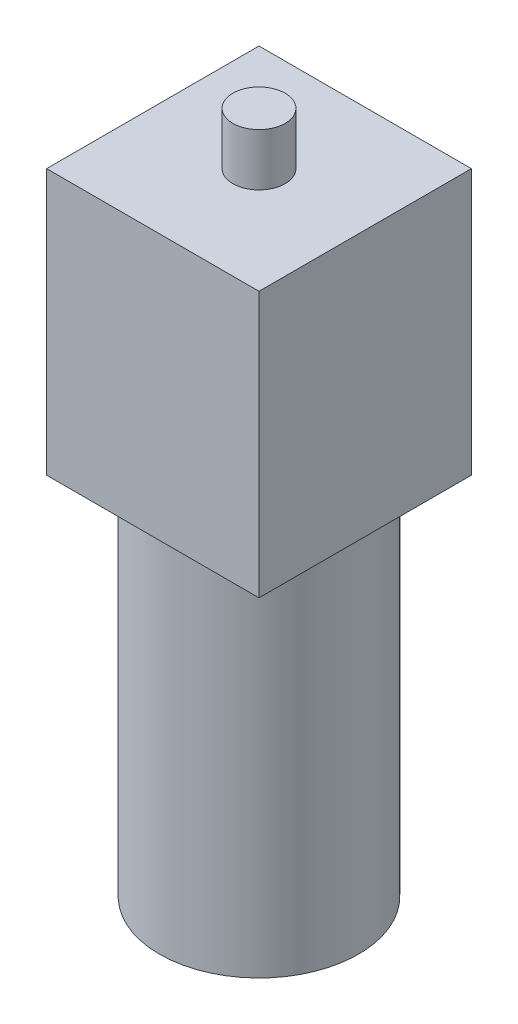
ISO-10303-21;
HEADER;
FILE_DESCRIPTION(('STEP AP214'),'2;1');
FILE_NAME('part.step','',(''),(''),'','','');
FILE_SCHEMA(('AUTOMOTIVE_DESIGN { 1 0 10303 214 1 1 1 1 }'));
ENDSEC;
DATA;
#1=APPLICATION_CONTEXT('core data for automotive mechanical design processes');
#2=APPLICATION_PROTOCOL_DEFINITION('international standard','automotive_design',2000,#1);
#3=PRODUCT_CONTEXT('',#1,'mechanical');
#4=PRODUCT('Part','Part','',(#3));
#5=PRODUCT_RELATED_PRODUCT_CATEGORY('part','',(#4));
#6=PRODUCT_DEFINITION_FORMATION('','',#4);
#7=PRODUCT_DEFINITION_CONTEXT('part definition',#1,'design');
#8=PRODUCT_DEFINITION('design','',#6,#7);
#9=PRODUCT_DEFINITION_SHAPE('','',#8);
#10=(LENGTH_UNIT() NAMED_UNIT(*) SI_UNIT(.MILLI.,.METRE.));
#11=(NAMED_UNIT(*) PLANE_ANGLE_UNIT() SI_UNIT($,.RADIAN.));
#12=(NAMED_UNIT(*) SI_UNIT($,.STERADIAN.) SOLID_ANGLE_UNIT());
#13=UNCERTAINTY_MEASURE_WITH_UNIT(LENGTH_MEASURE(1.E-05),#10,'distance_accuracy_value','');
#14=(GEOMETRIC_REPRESENTATION_CONTEXT(3) GLOBAL_UNCERTAINTY_ASSIGNED_CONTEXT((#13)) GLOBAL_UNIT_ASSIGNED_CONTEXT((#10,
#11,#12)) REPRESENTATION_CONTEXT('',''));
#15=CARTESIAN_POINT('',(0.,0.,0.));
#16=DIRECTION('',(0.,0.,1.));
#17=DIRECTION('',(1.,0.,0.));
#18=AXIS2_PLACEMENT_3D('',#15,#16,#17);
#19=CARTESIAN_POINT('',(0.,69.85,0.));
#20=DIRECTION('',(0.,-1.,0.));
#21=DIRECTION('',(0.,0.,-1.));
#22=AXIS2_PLACEMENT_3D('',#19,#20,#21);
#23=CYLINDRICAL_SURFACE('',#22,19.05);
#24=CARTESIAN_POINT('',(0.,69.85,0.));
#25=DIRECTION('',(0.,1.,0.));
#26=DIRECTION('',(0.,0.,1.));
#27=AXIS2_PLACEMENT_3D('',#24,#25,#26);
#28=CIRCLE('',#27,19.05);
#29=CARTESIAN_POINT('',(0.,69.85,19.05));
#30=VERTEX_POINT('',#29);
#31=EDGE_CURVE('E49',#30,#30,#28,.T.);
#32=ORIENTED_EDGE('',*,*,#31,.F.);
#33=EDGE_LOOP('',(#32));
#34=FACE_BOUND('',#33,.T.);
#35=CARTESIAN_POINT('',(0.,0.,0.));
#36=DIRECTION('',(0.,1.,0.));
#37=DIRECTION('',(0.,0.,1.));
#38=AXIS2_PLACEMENT_3D('',#35,#36,#37);
#39=CIRCLE('',#38,19.05);
#40=CARTESIAN_POINT('',(0.,0.,19.05));
#41=VERTEX_POINT('',#40);
#42=EDGE_CURVE('E42',#41,#41,#39,.T.);
#43=ORIENTED_EDGE('',*,*,#42,.T.);
#44=EDGE_LOOP('',(#43));
#45=FACE_BOUND('',#44,.T.);
#46=ADVANCED_FACE('F39',(#34,#45),#23,.T.);
#47=CARTESIAN_POINT('',(0.,0.,0.));
#48=DIRECTION('',(0.,1.,0.));
#49=DIRECTION('',(0.,0.,1.));
#50=AXIS2_PLACEMENT_3D('',#47,#48,#49);
#51=PLANE('',#50);
#52=ORIENTED_EDGE('',*,*,#42,.F.);
#53=EDGE_LOOP('',(#52));
#54=FACE_BOUND('',#53,.T.);
#55=ADVANCED_FACE('F140',(#54),#51,.F.);
#56=CARTESIAN_POINT('',(-20.32,120.65,-20.32));
#57=DIRECTION('',(1.,0.,0.));
#58=DIRECTION('',(0.,0.,-1.));
#59=AXIS2_PLACEMENT_3D('',#56,#57,#58);
#60=PLANE('',#59);
#61=DIRECTION('',(0.,0.,1.));
#62=VECTOR('',#61,1.);
#63=CARTESIAN_POINT('',(-20.32,69.85,-20.32));
#64=LINE('',#63,#62);
#65=CARTESIAN_POINT('',(-20.32,69.85,-20.32));
#66=VERTEX_POINT('',#65);
#67=CARTESIAN_POINT('',(-20.32,69.85,20.32));
#68=VERTEX_POINT('',#67);
#69=EDGE_CURVE('E113',#66,#68,#64,.T.);
#70=ORIENTED_EDGE('',*,*,#69,.T.);
#71=DIRECTION('',(0.,-1.,0.));
#72=VECTOR('',#71,1.);
#73=CARTESIAN_POINT('',(-20.32,120.65,20.32));
#74=LINE('',#73,#72);
#75=CARTESIAN_POINT('',(-20.32,120.65,20.32));
#76=VERTEX_POINT('',#75);
#77=EDGE_CURVE('E103',#76,#68,#74,.T.);
#78=ORIENTED_EDGE('',*,*,#77,.F.);
#79=DIRECTION('',(0.,0.,1.));
#80=VECTOR('',#79,1.);
#81=CARTESIAN_POINT('',(-20.32,120.65,-20.32));
#82=LINE('',#81,#80);
#83=CARTESIAN_POINT('',(-20.32,120.65,-20.32));
#84=VERTEX_POINT('',#83);
#85=EDGE_CURVE('E92',#84,#76,#82,.T.);
#86=ORIENTED_EDGE('',*,*,#85,.F.);
#87=DIRECTION('',(0.,-1.,0.));
#88=VECTOR('',#87,1.);
#89=CARTESIAN_POINT('',(-20.32,120.65,-20.32));
#90=LINE('',#89,#88);
#91=EDGE_CURVE('E58',#84,#66,#90,.T.);
#92=ORIENTED_EDGE('',*,*,#91,.T.);
#93=EDGE_LOOP('',(#70,#78,#86,#92));
#94=FACE_BOUND('',#93,.T.);
#95=ADVANCED_FACE('F142',(#94),#60,.F.);
#96=CARTESIAN_POINT('',(-20.32,120.65,20.32));
#97=DIRECTION('',(0.,0.,-1.));
#98=DIRECTION('',(-1.,0.,0.));
#99=AXIS2_PLACEMENT_3D('',#96,#97,#98);
#100=PLANE('',#99);
#101=DIRECTION('',(1.,0.,0.));
#102=VECTOR('',#101,1.);
#103=CARTESIAN_POINT('',(-20.32,69.85,20.32));
#104=LINE('',#103,#102);
#105=CARTESIAN_POINT('',(20.32,69.85,20.32));
#106=VERTEX_POINT('',#105);
#107=EDGE_CURVE('E99',#68,#106,#104,.T.);
#108=ORIENTED_EDGE('',*,*,#107,.T.);
#109=DIRECTION('',(0.,-1.,0.));
#110=VECTOR('',#109,1.);
#111=CARTESIAN_POINT('',(20.32,120.65,20.32));
#112=LINE('',#111,#110);
#113=CARTESIAN_POINT('',(20.32,120.65,20.32));
#114=VERTEX_POINT('',#113);
#115=EDGE_CURVE('E97',#114,#106,#112,.T.);
#116=ORIENTED_EDGE('',*,*,#115,.F.);
#117=DIRECTION('',(1.,0.,0.));
#118=VECTOR('',#117,1.);
#119=CARTESIAN_POINT('',(-20.32,120.65,20.32));
#120=LINE('',#119,#118);
#121=EDGE_CURVE('E84',#76,#114,#120,.T.);
#122=ORIENTED_EDGE('',*,*,#121,.F.);
#123=ORIENTED_EDGE('',*,*,#77,.T.);
#124=EDGE_LOOP('',(#108,#116,#122,#123));
#125=FACE_BOUND('',#124,.T.);
#126=ADVANCED_FACE('F98',(#125),#100,.F.);
#127=CARTESIAN_POINT('',(20.32,120.65,-20.32));
#128=DIRECTION('',(1.,0.,0.));
#129=DIRECTION('',(0.,0.,-1.));
#130=AXIS2_PLACEMENT_3D('',#127,#128,#129);
#131=PLANE('',#130);
#132=DIRECTION('',(0.,0.,1.));
#133=VECTOR('',#132,1.);
#134=CARTESIAN_POINT('',(20.32,69.85,-20.32));
#135=LINE('',#134,#133);
#136=CARTESIAN_POINT('',(20.32,69.85,-20.32));
#137=VERTEX_POINT('',#136);
#138=EDGE_CURVE('E119',#137,#106,#135,.T.);
#139=ORIENTED_EDGE('',*,*,#138,.F.);
#140=DIRECTION('',(0.,-1.,0.));
#141=VECTOR('',#140,1.);
#142=CARTESIAN_POINT('',(20.32,120.65,-20.32));
#143=LINE('',#142,#141);
#144=CARTESIAN_POINT('',(20.32,120.65,-20.32));
#145=VERTEX_POINT('',#144);
#146=EDGE_CURVE('E72',#145,#137,#143,.T.);
#147=ORIENTED_EDGE('',*,*,#146,.F.);
#148=DIRECTION('',(0.,0.,1.));
#149=VECTOR('',#148,1.);
#150=CARTESIAN_POINT('',(20.32,120.65,-20.32));
#151=LINE('',#150,#149);
#152=EDGE_CURVE('E91',#145,#114,#151,.T.);
#153=ORIENTED_EDGE('',*,*,#152,.T.);
#154=ORIENTED_EDGE('',*,*,#115,.T.);
#155=EDGE_LOOP('',(#139,#147,#153,#154));
#156=FACE_BOUND('',#155,.T.);
#157=ADVANCED_FACE('F105',(#156),#131,.T.);
#158=CARTESIAN_POINT('',(-20.32,120.65,-20.32));
#159=DIRECTION('',(0.,0.,-1.));
#160=DIRECTION('',(-1.,0.,0.));
#161=AXIS2_PLACEMENT_3D('',#158,#159,#160);
#162=PLANE('',#161);
#163=DIRECTION('',(1.,0.,0.));
#164=VECTOR('',#163,1.);
#165=CARTESIAN_POINT('',(-20.32,69.85,-20.32));
#166=LINE('',#165,#164);
#167=EDGE_CURVE('E122',#66,#137,#166,.T.);
#168=ORIENTED_EDGE('',*,*,#167,.F.);
#169=ORIENTED_EDGE('',*,*,#91,.F.);
#170=DIRECTION('',(1.,0.,0.));
#171=VECTOR('',#170,1.);
#172=CARTESIAN_POINT('',(-20.32,120.65,-20.32));
#173=LINE('',#172,#171);
#174=EDGE_CURVE('E107',#84,#145,#173,.T.);
#175=ORIENTED_EDGE('',*,*,#174,.T.);
#176=ORIENTED_EDGE('',*,*,#146,.T.);
#177=EDGE_LOOP('',(#168,#169,#175,#176));
#178=FACE_BOUND('',#177,.T.);
#179=ADVANCED_FACE('F154',(#178),#162,.T.);
#180=CARTESIAN_POINT('',(0.,120.65,0.));
#181=DIRECTION('',(0.,1.,0.));
#182=DIRECTION('',(0.,0.,1.));
#183=AXIS2_PLACEMENT_3D('',#180,#181,#182);
#184=PLANE('',#183);
#185=CARTESIAN_POINT('',(0.,120.65,0.));
#186=DIRECTION('',(0.,1.,0.));
#187=DIRECTION('',(0.,0.,1.));
#188=AXIS2_PLACEMENT_3D('',#185,#186,#187);
#189=CIRCLE('',#188,5.);
#190=CARTESIAN_POINT('',(0.,120.65,5.));
#191=VERTEX_POINT('',#190);
#192=EDGE_CURVE('E11',#191,#191,#189,.T.);
#193=ORIENTED_EDGE('',*,*,#192,.F.);
#194=EDGE_LOOP('',(#193));
#195=FACE_BOUND('',#194,.T.);
#196=ORIENTED_EDGE('',*,*,#85,.T.);
#197=ORIENTED_EDGE('',*,*,#121,.T.);
#198=ORIENTED_EDGE('',*,*,#152,.F.);
#199=ORIENTED_EDGE('',*,*,#174,.F.);
#200=EDGE_LOOP('',(#196,#197,#198,#199));
#201=FACE_BOUND('',#200,.T.);
#202=ADVANCED_FACE('F88',(#195,#201),#184,.T.);
#203=CARTESIAN_POINT('',(0.,69.85,0.));
#204=DIRECTION('',(0.,1.,0.));
#205=DIRECTION('',(0.,0.,1.));
#206=AXIS2_PLACEMENT_3D('',#203,#204,#205);
#207=PLANE('',#206);
#208=ORIENTED_EDGE('',*,*,#31,.T.);
#209=EDGE_LOOP('',(#208));
#210=FACE_BOUND('',#209,.T.);
#211=ORIENTED_EDGE('',*,*,#69,.F.);
#212=ORIENTED_EDGE('',*,*,#167,.T.);
#213=ORIENTED_EDGE('',*,*,#138,.T.);
#214=ORIENTED_EDGE('',*,*,#107,.F.);
#215=EDGE_LOOP('',(#211,#212,#213,#214));
#216=FACE_BOUND('',#215,.T.);
#217=ADVANCED_FACE('F157',(#210,#216),#207,.F.);
#218=CARTESIAN_POINT('',(0.,130.65,0.));
#219=DIRECTION('',(0.,-1.,0.));
#220=DIRECTION('',(0.,0.,-1.));
#221=AXIS2_PLACEMENT_3D('',#218,#219,#220);
#222=CYLINDRICAL_SURFACE('',#221,5.);
#223=CARTESIAN_POINT('',(0.,130.65,0.));
#224=DIRECTION('',(0.,1.,0.));
#225=DIRECTION('',(0.,0.,1.));
#226=AXIS2_PLACEMENT_3D('',#223,#224,#225);
#227=CIRCLE('',#226,5.);
#228=CARTESIAN_POINT('',(0.,130.65,5.));
#229=VERTEX_POINT('',#228);
#230=EDGE_CURVE('E116',#229,#229,#227,.T.);
#231=ORIENTED_EDGE('',*,*,#230,.F.);
#232=EDGE_LOOP('',(#231));
#233=FACE_BOUND('',#232,.T.);
#234=ORIENTED_EDGE('',*,*,#192,.T.);
#235=EDGE_LOOP('',(#234));
#236=FACE_BOUND('',#235,.T.);
#237=ADVANCED_FACE('F160',(#233,#236),#222,.T.);
#238=CARTESIAN_POINT('',(0.,130.65,0.));
#239=DIRECTION('',(0.,1.,0.));
#240=DIRECTION('',(0.,0.,1.));
#241=AXIS2_PLACEMENT_3D('',#238,#239,#240);
#242=PLANE('',#241);
#243=ORIENTED_EDGE('',*,*,#230,.T.);
#244=EDGE_LOOP('',(#243));
#245=FACE_BOUND('',#244,.T.);
#246=ADVANCED_FACE('F166',(#245),#242,.T.);
#247=CLOSED_SHELL('',(#46,#55,#95,#126,#157,#179,#202,#217,#237,#246));
#248=MANIFOLD_SOLID_BREP('B2',#247);
#249=ADVANCED_BREP_SHAPE_REPRESENTATION('',(#18,#248),#14);
#250=SHAPE_DEFINITION_REPRESENTATION(#9,#249);
ENDSEC;
END-ISO-10303-21;
